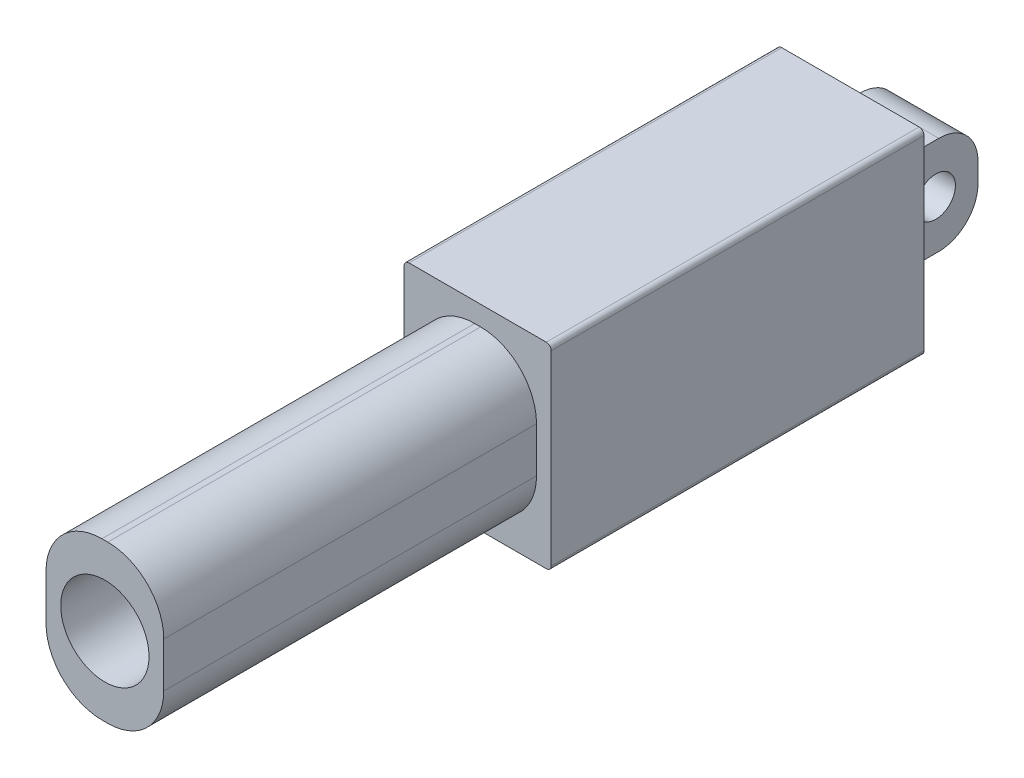
ISO-10303-21;
HEADER;
FILE_DESCRIPTION(('STEP AP214'),'2;1');
FILE_NAME('part.step','',(''),(''),'','','');
FILE_SCHEMA(('AUTOMOTIVE_DESIGN { 1 0 10303 214 1 1 1 1 }'));
ENDSEC;
DATA;
#1=APPLICATION_CONTEXT('core data for automotive mechanical design processes');
#2=APPLICATION_PROTOCOL_DEFINITION('international standard','automotive_design',2000,#1);
#3=PRODUCT_CONTEXT('',#1,'mechanical');
#4=PRODUCT('Part','Part','',(#3));
#5=PRODUCT_RELATED_PRODUCT_CATEGORY('part','',(#4));
#6=PRODUCT_DEFINITION_FORMATION('','',#4);
#7=PRODUCT_DEFINITION_CONTEXT('part definition',#1,'design');
#8=PRODUCT_DEFINITION('design','',#6,#7);
#9=PRODUCT_DEFINITION_SHAPE('','',#8);
#10=(LENGTH_UNIT() NAMED_UNIT(*) SI_UNIT(.MILLI.,.METRE.));
#11=(NAMED_UNIT(*) PLANE_ANGLE_UNIT() SI_UNIT($,.RADIAN.));
#12=(NAMED_UNIT(*) SI_UNIT($,.STERADIAN.) SOLID_ANGLE_UNIT());
#13=UNCERTAINTY_MEASURE_WITH_UNIT(LENGTH_MEASURE(1.E-05),#10,'distance_accuracy_value','');
#14=(GEOMETRIC_REPRESENTATION_CONTEXT(3) GLOBAL_UNCERTAINTY_ASSIGNED_CONTEXT((#13)) GLOBAL_UNIT_ASSIGNED_CONTEXT((#10,
#11,#12)) REPRESENTATION_CONTEXT('',''));
#15=CARTESIAN_POINT('',(0.,0.,0.));
#16=DIRECTION('',(0.,0.,1.));
#17=DIRECTION('',(1.,0.,0.));
#18=AXIS2_PLACEMENT_3D('',#15,#16,#17);
#19=CARTESIAN_POINT('',(0.,0.,0.));
#20=DIRECTION('',(0.,0.,1.));
#21=DIRECTION('',(1.,0.,0.));
#22=AXIS2_PLACEMENT_3D('',#19,#20,#21);
#23=PLANE('',#22);
#24=DIRECTION('',(-1.,0.,0.));
#25=VECTOR('',#24,1.);
#26=CARTESIAN_POINT('',(7.5,10.,0.));
#27=LINE('',#26,#25);
#28=CARTESIAN_POINT('',(7.,10.,0.));
#29=VERTEX_POINT('',#28);
#30=CARTESIAN_POINT('',(-7.,10.,0.));
#31=VERTEX_POINT('',#30);
#32=EDGE_CURVE('E291',#29,#31,#27,.T.);
#33=ORIENTED_EDGE('',*,*,#32,.F.);
#34=CARTESIAN_POINT('',(7.,9.5,0.));
#35=DIRECTION('',(0.,0.,1.));
#36=DIRECTION('',(1.,0.,0.));
#37=AXIS2_PLACEMENT_3D('',#34,#35,#36);
#38=CIRCLE('',#37,0.5);
#39=CARTESIAN_POINT('',(7.5,9.5,0.));
#40=VERTEX_POINT('',#39);
#41=EDGE_CURVE('E339',#29,#40,#38,.F.);
#42=ORIENTED_EDGE('',*,*,#41,.T.);
#43=DIRECTION('',(0.,1.,0.));
#44=VECTOR('',#43,1.);
#45=CARTESIAN_POINT('',(7.5,-10.,0.));
#46=LINE('',#45,#44);
#47=CARTESIAN_POINT('',(7.5,-9.5,0.));
#48=VERTEX_POINT('',#47);
#49=EDGE_CURVE('E304',#48,#40,#46,.T.);
#50=ORIENTED_EDGE('',*,*,#49,.F.);
#51=CARTESIAN_POINT('',(7.,-9.5,0.));
#52=DIRECTION('',(0.,0.,1.));
#53=DIRECTION('',(1.,0.,0.));
#54=AXIS2_PLACEMENT_3D('',#51,#52,#53);
#55=CIRCLE('',#54,0.5);
#56=CARTESIAN_POINT('',(7.,-10.,0.));
#57=VERTEX_POINT('',#56);
#58=EDGE_CURVE('E337',#48,#57,#55,.F.);
#59=ORIENTED_EDGE('',*,*,#58,.T.);
#60=DIRECTION('',(1.,0.,0.));
#61=VECTOR('',#60,1.);
#62=CARTESIAN_POINT('',(7.5,-10.,0.));
#63=LINE('',#62,#61);
#64=CARTESIAN_POINT('',(-7.,-10.,0.));
#65=VERTEX_POINT('',#64);
#66=EDGE_CURVE('E302',#65,#57,#63,.T.);
#67=ORIENTED_EDGE('',*,*,#66,.F.);
#68=CARTESIAN_POINT('',(-7.,-9.5,0.));
#69=DIRECTION('',(0.,0.,1.));
#70=DIRECTION('',(1.,0.,0.));
#71=AXIS2_PLACEMENT_3D('',#68,#69,#70);
#72=CIRCLE('',#71,0.5);
#73=CARTESIAN_POINT('',(-7.5,-9.5,0.));
#74=VERTEX_POINT('',#73);
#75=EDGE_CURVE('E333',#65,#74,#72,.F.);
#76=ORIENTED_EDGE('',*,*,#75,.T.);
#77=DIRECTION('',(0.,-1.,0.));
#78=VECTOR('',#77,1.);
#79=CARTESIAN_POINT('',(-7.5,-10.,0.));
#80=LINE('',#79,#78);
#81=CARTESIAN_POINT('',(-7.5,9.5,0.));
#82=VERTEX_POINT('',#81);
#83=EDGE_CURVE('E287',#82,#74,#80,.T.);
#84=ORIENTED_EDGE('',*,*,#83,.F.);
#85=CARTESIAN_POINT('',(-7.,9.5,0.));
#86=DIRECTION('',(0.,0.,1.));
#87=DIRECTION('',(1.,0.,0.));
#88=AXIS2_PLACEMENT_3D('',#85,#86,#87);
#89=CIRCLE('',#88,0.5);
#90=EDGE_CURVE('E335',#82,#31,#89,.F.);
#91=ORIENTED_EDGE('',*,*,#90,.T.);
#92=EDGE_LOOP('',(#33,#42,#50,#59,#67,#76,#84,#91));
#93=FACE_BOUND('',#92,.T.);
#94=DIRECTION('',(0.,1.,0.));
#95=VECTOR('',#94,1.);
#96=CARTESIAN_POINT('',(-4.,-5.,0.));
#97=LINE('',#96,#95);
#98=CARTESIAN_POINT('',(-4.,-5.,0.));
#99=VERTEX_POINT('',#98);
#100=CARTESIAN_POINT('',(-4.,5.,0.));
#101=VERTEX_POINT('',#100);
#102=EDGE_CURVE('E209',#99,#101,#97,.T.);
#103=ORIENTED_EDGE('',*,*,#102,.F.);
#104=DIRECTION('',(-1.,0.,0.));
#105=VECTOR('',#104,1.);
#106=CARTESIAN_POINT('',(4.,-5.,0.));
#107=LINE('',#106,#105);
#108=CARTESIAN_POINT('',(4.,-5.,0.));
#109=VERTEX_POINT('',#108);
#110=EDGE_CURVE('E205',#109,#99,#107,.T.);
#111=ORIENTED_EDGE('',*,*,#110,.F.);
#112=DIRECTION('',(0.,-1.,0.));
#113=VECTOR('',#112,1.);
#114=CARTESIAN_POINT('',(4.,-5.,0.));
#115=LINE('',#114,#113);
#116=CARTESIAN_POINT('',(4.,5.,0.));
#117=VERTEX_POINT('',#116);
#118=EDGE_CURVE('E189',#117,#109,#115,.T.);
#119=ORIENTED_EDGE('',*,*,#118,.F.);
#120=DIRECTION('',(1.,0.,0.));
#121=VECTOR('',#120,1.);
#122=CARTESIAN_POINT('',(4.,5.,0.));
#123=LINE('',#122,#121);
#124=EDGE_CURVE('E202',#101,#117,#123,.T.);
#125=ORIENTED_EDGE('',*,*,#124,.F.);
#126=EDGE_LOOP('',(#103,#111,#119,#125));
#127=FACE_BOUND('',#126,.T.);
#128=ADVANCED_FACE('F34',(#93,#127),#23,.F.);
#129=CARTESIAN_POINT('',(-7.5,-10.,38.));
#130=DIRECTION('',(1.,0.,0.));
#131=DIRECTION('',(0.,0.,-1.));
#132=AXIS2_PLACEMENT_3D('',#129,#130,#131);
#133=PLANE('',#132);
#134=DIRECTION('',(0.,-1.,0.));
#135=VECTOR('',#134,1.);
#136=CARTESIAN_POINT('',(-7.5,-10.,38.));
#137=LINE('',#136,#135);
#138=CARTESIAN_POINT('',(-7.5,9.5,38.));
#139=VERTEX_POINT('',#138);
#140=CARTESIAN_POINT('',(-7.5,-9.5,38.));
#141=VERTEX_POINT('',#140);
#142=EDGE_CURVE('E288',#139,#141,#137,.T.);
#143=ORIENTED_EDGE('',*,*,#142,.F.);
#144=DIRECTION('',(0.,0.,-1.));
#145=VECTOR('',#144,1.);
#146=CARTESIAN_POINT('',(-7.5,9.5,38.));
#147=LINE('',#146,#145);
#148=EDGE_CURVE('E11',#139,#82,#147,.T.);
#149=ORIENTED_EDGE('',*,*,#148,.T.);
#150=ORIENTED_EDGE('',*,*,#83,.T.);
#151=DIRECTION('',(0.,0.,-1.));
#152=VECTOR('',#151,1.);
#153=CARTESIAN_POINT('',(-7.5,-9.5,38.));
#154=LINE('',#153,#152);
#155=EDGE_CURVE('E42',#74,#141,#154,.F.);
#156=ORIENTED_EDGE('',*,*,#155,.T.);
#157=EDGE_LOOP('',(#143,#149,#150,#156));
#158=FACE_BOUND('',#157,.T.);
#159=ADVANCED_FACE('F359',(#158),#133,.F.);
#160=CARTESIAN_POINT('',(7.5,-10.,38.));
#161=DIRECTION('',(0.,1.,0.));
#162=DIRECTION('',(-1.,0.,0.));
#163=AXIS2_PLACEMENT_3D('',#160,#161,#162);
#164=PLANE('',#163);
#165=ORIENTED_EDGE('',*,*,#66,.T.);
#166=DIRECTION('',(0.,0.,-1.));
#167=VECTOR('',#166,1.);
#168=CARTESIAN_POINT('',(7.,-10.,38.));
#169=LINE('',#168,#167);
#170=CARTESIAN_POINT('',(7.,-10.,38.));
#171=VERTEX_POINT('',#170);
#172=EDGE_CURVE('E49',#57,#171,#169,.F.);
#173=ORIENTED_EDGE('',*,*,#172,.T.);
#174=DIRECTION('',(1.,0.,0.));
#175=VECTOR('',#174,1.);
#176=CARTESIAN_POINT('',(7.5,-10.,38.));
#177=LINE('',#176,#175);
#178=CARTESIAN_POINT('',(-7.,-10.,38.));
#179=VERTEX_POINT('',#178);
#180=EDGE_CURVE('E290',#179,#171,#177,.T.);
#181=ORIENTED_EDGE('',*,*,#180,.F.);
#182=DIRECTION('',(0.,0.,-1.));
#183=VECTOR('',#182,1.);
#184=CARTESIAN_POINT('',(-7.,-10.,38.));
#185=LINE('',#184,#183);
#186=EDGE_CURVE('E353',#179,#65,#185,.T.);
#187=ORIENTED_EDGE('',*,*,#186,.T.);
#188=EDGE_LOOP('',(#165,#173,#181,#187));
#189=FACE_BOUND('',#188,.T.);
#190=ADVANCED_FACE('F367',(#189),#164,.F.);
#191=CARTESIAN_POINT('',(7.5,-10.,38.));
#192=DIRECTION('',(-1.,0.,0.));
#193=DIRECTION('',(0.,0.,1.));
#194=AXIS2_PLACEMENT_3D('',#191,#192,#193);
#195=PLANE('',#194);
#196=ORIENTED_EDGE('',*,*,#49,.T.);
#197=DIRECTION('',(0.,0.,-1.));
#198=VECTOR('',#197,1.);
#199=CARTESIAN_POINT('',(7.5,9.5,38.));
#200=LINE('',#199,#198);
#201=CARTESIAN_POINT('',(7.5,9.5,38.));
#202=VERTEX_POINT('',#201);
#203=EDGE_CURVE('E344',#40,#202,#200,.F.);
#204=ORIENTED_EDGE('',*,*,#203,.T.);
#205=DIRECTION('',(0.,1.,0.));
#206=VECTOR('',#205,1.);
#207=CARTESIAN_POINT('',(7.5,-10.,38.));
#208=LINE('',#207,#206);
#209=CARTESIAN_POINT('',(7.5,-9.5,38.));
#210=VERTEX_POINT('',#209);
#211=EDGE_CURVE('E293',#210,#202,#208,.T.);
#212=ORIENTED_EDGE('',*,*,#211,.F.);
#213=DIRECTION('',(0.,0.,-1.));
#214=VECTOR('',#213,1.);
#215=CARTESIAN_POINT('',(7.5,-9.5,38.));
#216=LINE('',#215,#214);
#217=EDGE_CURVE('E341',#210,#48,#216,.T.);
#218=ORIENTED_EDGE('',*,*,#217,.T.);
#219=EDGE_LOOP('',(#196,#204,#212,#218));
#220=FACE_BOUND('',#219,.T.);
#221=ADVANCED_FACE('F377',(#220),#195,.F.);
#222=CARTESIAN_POINT('',(7.5,10.,38.));
#223=DIRECTION('',(0.,-1.,0.));
#224=DIRECTION('',(1.,0.,0.));
#225=AXIS2_PLACEMENT_3D('',#222,#223,#224);
#226=PLANE('',#225);
#227=DIRECTION('',(-1.,0.,0.));
#228=VECTOR('',#227,1.);
#229=CARTESIAN_POINT('',(7.5,10.,38.));
#230=LINE('',#229,#228);
#231=CARTESIAN_POINT('',(7.,10.,38.));
#232=VERTEX_POINT('',#231);
#233=CARTESIAN_POINT('',(-7.,10.,38.));
#234=VERTEX_POINT('',#233);
#235=EDGE_CURVE('E296',#232,#234,#230,.T.);
#236=ORIENTED_EDGE('',*,*,#235,.F.);
#237=DIRECTION('',(0.,0.,-1.));
#238=VECTOR('',#237,1.);
#239=CARTESIAN_POINT('',(7.,10.,38.));
#240=LINE('',#239,#238);
#241=EDGE_CURVE('E330',#232,#29,#240,.T.);
#242=ORIENTED_EDGE('',*,*,#241,.T.);
#243=ORIENTED_EDGE('',*,*,#32,.T.);
#244=DIRECTION('',(0.,0.,-1.));
#245=VECTOR('',#244,1.);
#246=CARTESIAN_POINT('',(-7.,10.,38.));
#247=LINE('',#246,#245);
#248=EDGE_CURVE('E325',#31,#234,#247,.F.);
#249=ORIENTED_EDGE('',*,*,#248,.T.);
#250=EDGE_LOOP('',(#236,#242,#243,#249));
#251=FACE_BOUND('',#250,.T.);
#252=ADVANCED_FACE('F385',(#251),#226,.F.);
#253=CARTESIAN_POINT('',(0.,0.,38.));
#254=DIRECTION('',(0.,0.,1.));
#255=DIRECTION('',(1.,0.,0.));
#256=AXIS2_PLACEMENT_3D('',#253,#254,#255);
#257=PLANE('',#256);
#258=CARTESIAN_POINT('',(-0.3,-2.3,38.));
#259=DIRECTION('',(0.,0.,1.));
#260=DIRECTION('',(-1.,0.,0.));
#261=AXIS2_PLACEMENT_3D('',#258,#259,#260);
#262=CIRCLE('',#261,5.7);
#263=CARTESIAN_POINT('',(-6.,-2.29999999999996,38.));
#264=VERTEX_POINT('',#263);
#265=CARTESIAN_POINT('',(-0.299999999999959,-8.,38.));
#266=VERTEX_POINT('',#265);
#267=EDGE_CURVE('E222',#264,#266,#262,.T.);
#268=ORIENTED_EDGE('',*,*,#267,.F.);
#269=DIRECTION('',(0.,-1.,0.));
#270=VECTOR('',#269,1.);
#271=CARTESIAN_POINT('',(-6.,-2.29999999999996,38.));
#272=LINE('',#271,#270);
#273=CARTESIAN_POINT('',(-6.,2.29999999999996,38.));
#274=VERTEX_POINT('',#273);
#275=EDGE_CURVE('E227',#274,#264,#272,.T.);
#276=ORIENTED_EDGE('',*,*,#275,.F.);
#277=CARTESIAN_POINT('',(-0.299999999999999,2.3,38.));
#278=DIRECTION('',(0.,0.,1.));
#279=DIRECTION('',(1.,0.,0.));
#280=AXIS2_PLACEMENT_3D('',#277,#278,#279);
#281=CIRCLE('',#280,5.7);
#282=CARTESIAN_POINT('',(-0.299999999999959,8.,38.));
#283=VERTEX_POINT('',#282);
#284=EDGE_CURVE('E259',#283,#274,#281,.T.);
#285=ORIENTED_EDGE('',*,*,#284,.F.);
#286=DIRECTION('',(-1.,0.,0.));
#287=VECTOR('',#286,1.);
#288=CARTESIAN_POINT('',(0.299999999999959,8.,38.));
#289=LINE('',#288,#287);
#290=CARTESIAN_POINT('',(0.299999999999959,8.,38.));
#291=VERTEX_POINT('',#290);
#292=EDGE_CURVE('E256',#291,#283,#289,.T.);
#293=ORIENTED_EDGE('',*,*,#292,.F.);
#294=CARTESIAN_POINT('',(0.3,2.3,38.));
#295=DIRECTION('',(0.,0.,1.));
#296=DIRECTION('',(-1.,0.,0.));
#297=AXIS2_PLACEMENT_3D('',#294,#295,#296);
#298=CIRCLE('',#297,5.7);
#299=CARTESIAN_POINT('',(6.,2.29999999999996,38.));
#300=VERTEX_POINT('',#299);
#301=EDGE_CURVE('E253',#300,#291,#298,.T.);
#302=ORIENTED_EDGE('',*,*,#301,.F.);
#303=DIRECTION('',(0.,1.,0.));
#304=VECTOR('',#303,1.);
#305=CARTESIAN_POINT('',(6.,-2.29999999999996,38.));
#306=LINE('',#305,#304);
#307=CARTESIAN_POINT('',(6.,-2.3,38.));
#308=VERTEX_POINT('',#307);
#309=EDGE_CURVE('E250',#308,#300,#306,.T.);
#310=ORIENTED_EDGE('',*,*,#309,.F.);
#311=CARTESIAN_POINT('',(0.299999999999999,-2.3,38.));
#312=DIRECTION('',(0.,0.,1.));
#313=DIRECTION('',(1.,0.,0.));
#314=AXIS2_PLACEMENT_3D('',#311,#312,#313);
#315=CIRCLE('',#314,5.7);
#316=CARTESIAN_POINT('',(0.299999999999959,-8.,38.));
#317=VERTEX_POINT('',#316);
#318=EDGE_CURVE('E247',#317,#308,#315,.T.);
#319=ORIENTED_EDGE('',*,*,#318,.F.);
#320=DIRECTION('',(1.,0.,0.));
#321=VECTOR('',#320,1.);
#322=CARTESIAN_POINT('',(0.299999999999959,-8.,38.));
#323=LINE('',#322,#321);
#324=EDGE_CURVE('E244',#266,#317,#323,.T.);
#325=ORIENTED_EDGE('',*,*,#324,.F.);
#326=EDGE_LOOP('',(#268,#276,#285,#293,#302,#310,#319,#325));
#327=FACE_BOUND('',#326,.T.);
#328=ORIENTED_EDGE('',*,*,#211,.T.);
#329=CARTESIAN_POINT('',(7.,9.5,38.));
#330=DIRECTION('',(0.,0.,1.));
#331=DIRECTION('',(1.,0.,0.));
#332=AXIS2_PLACEMENT_3D('',#329,#330,#331);
#333=CIRCLE('',#332,0.5);
#334=EDGE_CURVE('E351',#202,#232,#333,.T.);
#335=ORIENTED_EDGE('',*,*,#334,.T.);
#336=ORIENTED_EDGE('',*,*,#235,.T.);
#337=CARTESIAN_POINT('',(-7.,9.5,38.));
#338=DIRECTION('',(0.,0.,1.));
#339=DIRECTION('',(1.,0.,0.));
#340=AXIS2_PLACEMENT_3D('',#337,#338,#339);
#341=CIRCLE('',#340,0.5);
#342=EDGE_CURVE('E347',#234,#139,#341,.T.);
#343=ORIENTED_EDGE('',*,*,#342,.T.);
#344=ORIENTED_EDGE('',*,*,#142,.T.);
#345=CARTESIAN_POINT('',(-7.,-9.5,38.));
#346=DIRECTION('',(0.,0.,1.));
#347=DIRECTION('',(1.,0.,0.));
#348=AXIS2_PLACEMENT_3D('',#345,#346,#347);
#349=CIRCLE('',#348,0.5);
#350=EDGE_CURVE('E56',#141,#179,#349,.T.);
#351=ORIENTED_EDGE('',*,*,#350,.T.);
#352=ORIENTED_EDGE('',*,*,#180,.T.);
#353=CARTESIAN_POINT('',(7.,-9.5,38.));
#354=DIRECTION('',(0.,0.,1.));
#355=DIRECTION('',(1.,0.,0.));
#356=AXIS2_PLACEMENT_3D('',#353,#354,#355);
#357=CIRCLE('',#356,0.5);
#358=EDGE_CURVE('E349',#171,#210,#357,.T.);
#359=ORIENTED_EDGE('',*,*,#358,.T.);
#360=EDGE_LOOP('',(#328,#335,#336,#343,#344,#351,#352,#359));
#361=FACE_BOUND('',#360,.T.);
#362=ADVANCED_FACE('F363',(#327,#361),#257,.T.);
#363=CARTESIAN_POINT('',(-0.3,-2.3,76.));
#364=DIRECTION('',(0.,0.,-1.));
#365=DIRECTION('',(-1.,0.,0.));
#366=AXIS2_PLACEMENT_3D('',#363,#364,#365);
#367=CYLINDRICAL_SURFACE('',#366,5.7);
#368=ORIENTED_EDGE('',*,*,#267,.T.);
#369=DIRECTION('',(0.,0.,-1.));
#370=VECTOR('',#369,1.);
#371=CARTESIAN_POINT('',(-0.299999999999959,-8.,76.));
#372=LINE('',#371,#370);
#373=CARTESIAN_POINT('',(-0.299999999999959,-8.,76.));
#374=VERTEX_POINT('',#373);
#375=EDGE_CURVE('E284',#374,#266,#372,.T.);
#376=ORIENTED_EDGE('',*,*,#375,.F.);
#377=CARTESIAN_POINT('',(-0.3,-2.3,76.));
#378=DIRECTION('',(0.,0.,1.));
#379=DIRECTION('',(-1.,0.,0.));
#380=AXIS2_PLACEMENT_3D('',#377,#378,#379);
#381=CIRCLE('',#380,5.7);
#382=CARTESIAN_POINT('',(-6.,-2.29999999999996,76.));
#383=VERTEX_POINT('',#382);
#384=EDGE_CURVE('E223',#383,#374,#381,.T.);
#385=ORIENTED_EDGE('',*,*,#384,.F.);
#386=DIRECTION('',(0.,0.,-1.));
#387=VECTOR('',#386,1.);
#388=CARTESIAN_POINT('',(-6.,-2.29999999999996,76.));
#389=LINE('',#388,#387);
#390=EDGE_CURVE('E241',#383,#264,#389,.T.);
#391=ORIENTED_EDGE('',*,*,#390,.T.);
#392=EDGE_LOOP('',(#368,#376,#385,#391));
#393=FACE_BOUND('',#392,.T.);
#394=ADVANCED_FACE('F480',(#393),#367,.T.);
#395=CARTESIAN_POINT('',(0.299999999999959,-8.,76.));
#396=DIRECTION('',(0.,1.,0.));
#397=DIRECTION('',(0.,0.,1.));
#398=AXIS2_PLACEMENT_3D('',#395,#396,#397);
#399=PLANE('',#398);
#400=ORIENTED_EDGE('',*,*,#324,.T.);
#401=DIRECTION('',(0.,0.,-1.));
#402=VECTOR('',#401,1.);
#403=CARTESIAN_POINT('',(0.299999999999959,-8.,76.));
#404=LINE('',#403,#402);
#405=CARTESIAN_POINT('',(0.299999999999959,-8.,76.));
#406=VERTEX_POINT('',#405);
#407=EDGE_CURVE('E281',#406,#317,#404,.T.);
#408=ORIENTED_EDGE('',*,*,#407,.F.);
#409=DIRECTION('',(1.,0.,0.));
#410=VECTOR('',#409,1.);
#411=CARTESIAN_POINT('',(0.299999999999959,-8.,76.));
#412=LINE('',#411,#410);
#413=EDGE_CURVE('E226',#374,#406,#412,.T.);
#414=ORIENTED_EDGE('',*,*,#413,.F.);
#415=ORIENTED_EDGE('',*,*,#375,.T.);
#416=EDGE_LOOP('',(#400,#408,#414,#415));
#417=FACE_BOUND('',#416,.T.);
#418=ADVANCED_FACE('F477',(#417),#399,.F.);
#419=CARTESIAN_POINT('',(0.299999999999999,-2.3,76.));
#420=DIRECTION('',(0.,0.,-1.));
#421=DIRECTION('',(-1.,0.,0.));
#422=AXIS2_PLACEMENT_3D('',#419,#420,#421);
#423=CYLINDRICAL_SURFACE('',#422,5.7);
#424=ORIENTED_EDGE('',*,*,#318,.T.);
#425=DIRECTION('',(0.,0.,-1.));
#426=VECTOR('',#425,1.);
#427=CARTESIAN_POINT('',(6.,-2.3,76.));
#428=LINE('',#427,#426);
#429=CARTESIAN_POINT('',(6.,-2.3,76.));
#430=VERTEX_POINT('',#429);
#431=EDGE_CURVE('E278',#430,#308,#428,.T.);
#432=ORIENTED_EDGE('',*,*,#431,.F.);
#433=CARTESIAN_POINT('',(0.299999999999999,-2.3,76.));
#434=DIRECTION('',(0.,0.,1.));
#435=DIRECTION('',(1.,0.,0.));
#436=AXIS2_PLACEMENT_3D('',#433,#434,#435);
#437=CIRCLE('',#436,5.7);
#438=EDGE_CURVE('E229',#406,#430,#437,.T.);
#439=ORIENTED_EDGE('',*,*,#438,.F.);
#440=ORIENTED_EDGE('',*,*,#407,.T.);
#441=EDGE_LOOP('',(#424,#432,#439,#440));
#442=FACE_BOUND('',#441,.T.);
#443=ADVANCED_FACE('F473',(#442),#423,.T.);
#444=CARTESIAN_POINT('',(6.,-2.29999999999996,76.));
#445=DIRECTION('',(-1.,0.,0.));
#446=DIRECTION('',(0.,0.,1.));
#447=AXIS2_PLACEMENT_3D('',#444,#445,#446);
#448=PLANE('',#447);
#449=ORIENTED_EDGE('',*,*,#309,.T.);
#450=DIRECTION('',(0.,0.,-1.));
#451=VECTOR('',#450,1.);
#452=CARTESIAN_POINT('',(6.,2.29999999999996,76.));
#453=LINE('',#452,#451);
#454=CARTESIAN_POINT('',(6.,2.29999999999996,76.));
#455=VERTEX_POINT('',#454);
#456=EDGE_CURVE('E275',#455,#300,#453,.T.);
#457=ORIENTED_EDGE('',*,*,#456,.F.);
#458=DIRECTION('',(0.,1.,0.));
#459=VECTOR('',#458,1.);
#460=CARTESIAN_POINT('',(6.,-2.29999999999996,76.));
#461=LINE('',#460,#459);
#462=EDGE_CURVE('E231',#430,#455,#461,.T.);
#463=ORIENTED_EDGE('',*,*,#462,.F.);
#464=ORIENTED_EDGE('',*,*,#431,.T.);
#465=EDGE_LOOP('',(#449,#457,#463,#464));
#466=FACE_BOUND('',#465,.T.);
#467=ADVANCED_FACE('F469',(#466),#448,.F.);
#468=CARTESIAN_POINT('',(0.3,2.3,76.));
#469=DIRECTION('',(0.,0.,-1.));
#470=DIRECTION('',(-1.,0.,0.));
#471=AXIS2_PLACEMENT_3D('',#468,#469,#470);
#472=CYLINDRICAL_SURFACE('',#471,5.7);
#473=ORIENTED_EDGE('',*,*,#301,.T.);
#474=DIRECTION('',(0.,0.,-1.));
#475=VECTOR('',#474,1.);
#476=CARTESIAN_POINT('',(0.299999999999959,8.,76.));
#477=LINE('',#476,#475);
#478=CARTESIAN_POINT('',(0.299999999999959,8.,76.));
#479=VERTEX_POINT('',#478);
#480=EDGE_CURVE('E272',#479,#291,#477,.T.);
#481=ORIENTED_EDGE('',*,*,#480,.F.);
#482=CARTESIAN_POINT('',(0.3,2.3,76.));
#483=DIRECTION('',(0.,0.,1.));
#484=DIRECTION('',(-1.,0.,0.));
#485=AXIS2_PLACEMENT_3D('',#482,#483,#484);
#486=CIRCLE('',#485,5.7);
#487=EDGE_CURVE('E233',#455,#479,#486,.T.);
#488=ORIENTED_EDGE('',*,*,#487,.F.);
#489=ORIENTED_EDGE('',*,*,#456,.T.);
#490=EDGE_LOOP('',(#473,#481,#488,#489));
#491=FACE_BOUND('',#490,.T.);
#492=ADVANCED_FACE('F465',(#491),#472,.T.);
#493=CARTESIAN_POINT('',(0.299999999999959,8.,76.));
#494=DIRECTION('',(0.,-1.,0.));
#495=DIRECTION('',(0.,0.,-1.));
#496=AXIS2_PLACEMENT_3D('',#493,#494,#495);
#497=PLANE('',#496);
#498=ORIENTED_EDGE('',*,*,#292,.T.);
#499=DIRECTION('',(0.,0.,-1.));
#500=VECTOR('',#499,1.);
#501=CARTESIAN_POINT('',(-0.299999999999959,8.,76.));
#502=LINE('',#501,#500);
#503=CARTESIAN_POINT('',(-0.299999999999959,8.,76.));
#504=VERTEX_POINT('',#503);
#505=EDGE_CURVE('E269',#504,#283,#502,.T.);
#506=ORIENTED_EDGE('',*,*,#505,.F.);
#507=DIRECTION('',(-1.,0.,0.));
#508=VECTOR('',#507,1.);
#509=CARTESIAN_POINT('',(0.299999999999959,8.,76.));
#510=LINE('',#509,#508);
#511=EDGE_CURVE('E235',#479,#504,#510,.T.);
#512=ORIENTED_EDGE('',*,*,#511,.F.);
#513=ORIENTED_EDGE('',*,*,#480,.T.);
#514=EDGE_LOOP('',(#498,#506,#512,#513));
#515=FACE_BOUND('',#514,.T.);
#516=ADVANCED_FACE('F461',(#515),#497,.F.);
#517=CARTESIAN_POINT('',(-0.299999999999999,2.3,76.));
#518=DIRECTION('',(0.,0.,-1.));
#519=DIRECTION('',(-1.,0.,0.));
#520=AXIS2_PLACEMENT_3D('',#517,#518,#519);
#521=CYLINDRICAL_SURFACE('',#520,5.7);
#522=ORIENTED_EDGE('',*,*,#284,.T.);
#523=DIRECTION('',(0.,0.,-1.));
#524=VECTOR('',#523,1.);
#525=CARTESIAN_POINT('',(-6.,2.29999999999996,76.));
#526=LINE('',#525,#524);
#527=CARTESIAN_POINT('',(-6.,2.29999999999996,76.));
#528=VERTEX_POINT('',#527);
#529=EDGE_CURVE('E266',#528,#274,#526,.T.);
#530=ORIENTED_EDGE('',*,*,#529,.F.);
#531=CARTESIAN_POINT('',(-0.299999999999999,2.3,76.));
#532=DIRECTION('',(0.,0.,1.));
#533=DIRECTION('',(1.,0.,0.));
#534=AXIS2_PLACEMENT_3D('',#531,#532,#533);
#535=CIRCLE('',#534,5.7);
#536=EDGE_CURVE('E237',#504,#528,#535,.T.);
#537=ORIENTED_EDGE('',*,*,#536,.F.);
#538=ORIENTED_EDGE('',*,*,#505,.T.);
#539=EDGE_LOOP('',(#522,#530,#537,#538));
#540=FACE_BOUND('',#539,.T.);
#541=ADVANCED_FACE('F457',(#540),#521,.T.);
#542=CARTESIAN_POINT('',(-6.,-2.29999999999996,76.));
#543=DIRECTION('',(1.,0.,0.));
#544=DIRECTION('',(0.,0.,-1.));
#545=AXIS2_PLACEMENT_3D('',#542,#543,#544);
#546=PLANE('',#545);
#547=ORIENTED_EDGE('',*,*,#275,.T.);
#548=ORIENTED_EDGE('',*,*,#390,.F.);
#549=DIRECTION('',(0.,-1.,0.));
#550=VECTOR('',#549,1.);
#551=CARTESIAN_POINT('',(-6.,-2.29999999999996,76.));
#552=LINE('',#551,#550);
#553=EDGE_CURVE('E239',#528,#383,#552,.T.);
#554=ORIENTED_EDGE('',*,*,#553,.F.);
#555=ORIENTED_EDGE('',*,*,#529,.T.);
#556=EDGE_LOOP('',(#547,#548,#554,#555));
#557=FACE_BOUND('',#556,.T.);
#558=ADVANCED_FACE('F453',(#557),#546,.F.);
#559=CARTESIAN_POINT('',(-0.3,-2.3,76.));
#560=DIRECTION('',(0.,0.,-1.));
#561=DIRECTION('',(-1.,0.,0.));
#562=AXIS2_PLACEMENT_3D('',#559,#560,#561);
#563=PLANE('',#562);
#564=CARTESIAN_POINT('',(0.,0.,76.));
#565=DIRECTION('',(0.,0.,1.));
#566=DIRECTION('',(1.,0.,0.));
#567=AXIS2_PLACEMENT_3D('',#564,#565,#566);
#568=CIRCLE('',#567,4.5);
#569=CARTESIAN_POINT('',(4.5,0.,76.));
#570=VERTEX_POINT('',#569);
#571=EDGE_CURVE('E660',#570,#570,#568,.T.);
#572=ORIENTED_EDGE('',*,*,#571,.F.);
#573=EDGE_LOOP('',(#572));
#574=FACE_BOUND('',#573,.T.);
#575=ORIENTED_EDGE('',*,*,#384,.T.);
#576=ORIENTED_EDGE('',*,*,#413,.T.);
#577=ORIENTED_EDGE('',*,*,#438,.T.);
#578=ORIENTED_EDGE('',*,*,#462,.T.);
#579=ORIENTED_EDGE('',*,*,#487,.T.);
#580=ORIENTED_EDGE('',*,*,#511,.T.);
#581=ORIENTED_EDGE('',*,*,#536,.T.);
#582=ORIENTED_EDGE('',*,*,#553,.T.);
#583=EDGE_LOOP('',(#575,#576,#577,#578,#579,#580,#581,#582));
#584=FACE_BOUND('',#583,.T.);
#585=ADVANCED_FACE('F449',(#574,#584),#563,.F.);
#586=CARTESIAN_POINT('',(-4.,-5.,-9.));
#587=DIRECTION('',(1.,0.,0.));
#588=DIRECTION('',(0.,0.,-1.));
#589=AXIS2_PLACEMENT_3D('',#586,#587,#588);
#590=PLANE('',#589);
#591=CARTESIAN_POINT('',(-4.,0.,-4.7));
#592=DIRECTION('',(-1.,0.,0.));
#593=DIRECTION('',(0.,0.,1.));
#594=AXIS2_PLACEMENT_3D('',#591,#592,#593);
#595=CIRCLE('',#594,2.);
#596=CARTESIAN_POINT('',(-4.,0.,-2.7));
#597=VERTEX_POINT('',#596);
#598=EDGE_CURVE('E328',#597,#597,#595,.T.);
#599=ORIENTED_EDGE('',*,*,#598,.F.);
#600=EDGE_LOOP('',(#599));
#601=FACE_BOUND('',#600,.T.);
#602=DIRECTION('',(0.,1.,0.));
#603=VECTOR('',#602,1.);
#604=CARTESIAN_POINT('',(-4.,-5.,-9.));
#605=LINE('',#604,#603);
#606=CARTESIAN_POINT('',(-4.,-1.,-9.));
#607=VERTEX_POINT('',#606);
#608=CARTESIAN_POINT('',(-4.,1.,-9.));
#609=VERTEX_POINT('',#608);
#610=EDGE_CURVE('E216',#607,#609,#605,.T.);
#611=ORIENTED_EDGE('',*,*,#610,.F.);
#612=CARTESIAN_POINT('',(-4.,-1.,-5.));
#613=DIRECTION('',(1.,0.,0.));
#614=DIRECTION('',(0.,0.,-1.));
#615=AXIS2_PLACEMENT_3D('',#612,#613,#614);
#616=CIRCLE('',#615,4.);
#617=CARTESIAN_POINT('',(-4.,-5.,-5.));
#618=VERTEX_POINT('',#617);
#619=EDGE_CURVE('E316',#607,#618,#616,.F.);
#620=ORIENTED_EDGE('',*,*,#619,.T.);
#621=DIRECTION('',(0.,0.,1.));
#622=VECTOR('',#621,1.);
#623=CARTESIAN_POINT('',(-4.,-5.,-9.));
#624=LINE('',#623,#622);
#625=EDGE_CURVE('E217',#618,#99,#624,.T.);
#626=ORIENTED_EDGE('',*,*,#625,.T.);
#627=ORIENTED_EDGE('',*,*,#102,.T.);
#628=DIRECTION('',(0.,0.,1.));
#629=VECTOR('',#628,1.);
#630=CARTESIAN_POINT('',(-4.,5.,-9.));
#631=LINE('',#630,#629);
#632=CARTESIAN_POINT('',(-4.,5.,-5.));
#633=VERTEX_POINT('',#632);
#634=EDGE_CURVE('E195',#633,#101,#631,.T.);
#635=ORIENTED_EDGE('',*,*,#634,.F.);
#636=CARTESIAN_POINT('',(-4.,1.,-5.));
#637=DIRECTION('',(1.,0.,0.));
#638=DIRECTION('',(0.,0.,-1.));
#639=AXIS2_PLACEMENT_3D('',#636,#637,#638);
#640=CIRCLE('',#639,4.);
#641=EDGE_CURVE('E314',#633,#609,#640,.F.);
#642=ORIENTED_EDGE('',*,*,#641,.T.);
#643=EDGE_LOOP('',(#611,#620,#626,#627,#635,#642));
#644=FACE_BOUND('',#643,.T.);
#645=ADVANCED_FACE('F446',(#601,#644),#590,.F.);
#646=CARTESIAN_POINT('',(4.,5.,-9.));
#647=DIRECTION('',(0.,-1.,0.));
#648=DIRECTION('',(0.,0.,-1.));
#649=AXIS2_PLACEMENT_3D('',#646,#647,#648);
#650=PLANE('',#649);
#651=DIRECTION('',(0.,0.,1.));
#652=VECTOR('',#651,1.);
#653=CARTESIAN_POINT('',(4.,5.,-9.));
#654=LINE('',#653,#652);
#655=CARTESIAN_POINT('',(4.,5.,-5.));
#656=VERTEX_POINT('',#655);
#657=EDGE_CURVE('E185',#656,#117,#654,.T.);
#658=ORIENTED_EDGE('',*,*,#657,.F.);
#659=DIRECTION('',(1.,0.,0.));
#660=VECTOR('',#659,1.);
#661=CARTESIAN_POINT('',(4.,5.,-5.));
#662=LINE('',#661,#660);
#663=EDGE_CURVE('E323',#656,#633,#662,.F.);
#664=ORIENTED_EDGE('',*,*,#663,.T.);
#665=ORIENTED_EDGE('',*,*,#634,.T.);
#666=ORIENTED_EDGE('',*,*,#124,.T.);
#667=EDGE_LOOP('',(#658,#664,#665,#666));
#668=FACE_BOUND('',#667,.T.);
#669=ADVANCED_FACE('F207',(#668),#650,.F.);
#670=CARTESIAN_POINT('',(4.,-5.,-9.));
#671=DIRECTION('',(-1.,0.,0.));
#672=DIRECTION('',(0.,0.,1.));
#673=AXIS2_PLACEMENT_3D('',#670,#671,#672);
#674=PLANE('',#673);
#675=CARTESIAN_POINT('',(4.,0.,-4.7));
#676=DIRECTION('',(-1.,0.,0.));
#677=DIRECTION('',(0.,0.,1.));
#678=AXIS2_PLACEMENT_3D('',#675,#676,#677);
#679=CIRCLE('',#678,2.);
#680=CARTESIAN_POINT('',(4.,0.,-2.7));
#681=VERTEX_POINT('',#680);
#682=EDGE_CURVE('E211',#681,#681,#679,.T.);
#683=ORIENTED_EDGE('',*,*,#682,.T.);
#684=EDGE_LOOP('',(#683));
#685=FACE_BOUND('',#684,.T.);
#686=DIRECTION('',(0.,0.,1.));
#687=VECTOR('',#686,1.);
#688=CARTESIAN_POINT('',(4.,-5.,-9.));
#689=LINE('',#688,#687);
#690=CARTESIAN_POINT('',(4.,-5.,-5.));
#691=VERTEX_POINT('',#690);
#692=EDGE_CURVE('E196',#691,#109,#689,.T.);
#693=ORIENTED_EDGE('',*,*,#692,.F.);
#694=CARTESIAN_POINT('',(4.,-1.,-5.));
#695=DIRECTION('',(-1.,0.,0.));
#696=DIRECTION('',(0.,0.,1.));
#697=AXIS2_PLACEMENT_3D('',#694,#695,#696);
#698=CIRCLE('',#697,4.);
#699=CARTESIAN_POINT('',(4.,-1.,-9.));
#700=VERTEX_POINT('',#699);
#701=EDGE_CURVE('E321',#691,#700,#698,.F.);
#702=ORIENTED_EDGE('',*,*,#701,.T.);
#703=DIRECTION('',(0.,-1.,0.));
#704=VECTOR('',#703,1.);
#705=CARTESIAN_POINT('',(4.,-5.,-9.));
#706=LINE('',#705,#704);
#707=CARTESIAN_POINT('',(4.,1.,-9.));
#708=VERTEX_POINT('',#707);
#709=EDGE_CURVE('E219',#708,#700,#706,.T.);
#710=ORIENTED_EDGE('',*,*,#709,.F.);
#711=CARTESIAN_POINT('',(4.,1.,-5.));
#712=DIRECTION('',(-1.,0.,0.));
#713=DIRECTION('',(0.,0.,1.));
#714=AXIS2_PLACEMENT_3D('',#711,#712,#713);
#715=CIRCLE('',#714,4.);
#716=EDGE_CURVE('E191',#708,#656,#715,.F.);
#717=ORIENTED_EDGE('',*,*,#716,.T.);
#718=ORIENTED_EDGE('',*,*,#657,.T.);
#719=ORIENTED_EDGE('',*,*,#118,.T.);
#720=EDGE_LOOP('',(#693,#702,#710,#717,#718,#719));
#721=FACE_BOUND('',#720,.T.);
#722=ADVANCED_FACE('F188',(#685,#721),#674,.F.);
#723=CARTESIAN_POINT('',(4.,-5.,-9.));
#724=DIRECTION('',(0.,1.,0.));
#725=DIRECTION('',(0.,0.,1.));
#726=AXIS2_PLACEMENT_3D('',#723,#724,#725);
#727=PLANE('',#726);
#728=ORIENTED_EDGE('',*,*,#625,.F.);
#729=DIRECTION('',(-1.,0.,0.));
#730=VECTOR('',#729,1.);
#731=CARTESIAN_POINT('',(4.,-5.,-5.));
#732=LINE('',#731,#730);
#733=EDGE_CURVE('E318',#618,#691,#732,.F.);
#734=ORIENTED_EDGE('',*,*,#733,.T.);
#735=ORIENTED_EDGE('',*,*,#692,.T.);
#736=ORIENTED_EDGE('',*,*,#110,.T.);
#737=EDGE_LOOP('',(#728,#734,#735,#736));
#738=FACE_BOUND('',#737,.T.);
#739=ADVANCED_FACE('F436',(#738),#727,.F.);
#740=CARTESIAN_POINT('',(0.,0.,-9.));
#741=DIRECTION('',(0.,0.,1.));
#742=DIRECTION('',(1.,0.,0.));
#743=AXIS2_PLACEMENT_3D('',#740,#741,#742);
#744=PLANE('',#743);
#745=ORIENTED_EDGE('',*,*,#709,.T.);
#746=DIRECTION('',(-1.,0.,0.));
#747=VECTOR('',#746,1.);
#748=CARTESIAN_POINT('',(0.,-1.,-9.));
#749=LINE('',#748,#747);
#750=EDGE_CURVE('E311',#700,#607,#749,.T.);
#751=ORIENTED_EDGE('',*,*,#750,.T.);
#752=ORIENTED_EDGE('',*,*,#610,.T.);
#753=DIRECTION('',(1.,0.,0.));
#754=VECTOR('',#753,1.);
#755=CARTESIAN_POINT('',(0.,1.,-9.));
#756=LINE('',#755,#754);
#757=EDGE_CURVE('E299',#609,#708,#756,.T.);
#758=ORIENTED_EDGE('',*,*,#757,.T.);
#759=EDGE_LOOP('',(#745,#751,#752,#758));
#760=FACE_BOUND('',#759,.T.);
#761=ADVANCED_FACE('F415',(#760),#744,.F.);
#762=CARTESIAN_POINT('',(0.,-1.,-5.));
#763=DIRECTION('',(-1.,0.,0.));
#764=DIRECTION('',(0.,0.,1.));
#765=AXIS2_PLACEMENT_3D('',#762,#763,#764);
#766=CYLINDRICAL_SURFACE('',#765,4.);
#767=ORIENTED_EDGE('',*,*,#701,.F.);
#768=ORIENTED_EDGE('',*,*,#733,.F.);
#769=ORIENTED_EDGE('',*,*,#619,.F.);
#770=ORIENTED_EDGE('',*,*,#750,.F.);
#771=EDGE_LOOP('',(#767,#768,#769,#770));
#772=FACE_BOUND('',#771,.T.);
#773=ADVANCED_FACE('F411',(#772),#766,.T.);
#774=CARTESIAN_POINT('',(0.,1.,-5.));
#775=DIRECTION('',(1.,0.,0.));
#776=DIRECTION('',(0.,0.,-1.));
#777=AXIS2_PLACEMENT_3D('',#774,#775,#776);
#778=CYLINDRICAL_SURFACE('',#777,4.);
#779=ORIENTED_EDGE('',*,*,#641,.F.);
#780=ORIENTED_EDGE('',*,*,#663,.F.);
#781=ORIENTED_EDGE('',*,*,#716,.F.);
#782=ORIENTED_EDGE('',*,*,#757,.F.);
#783=EDGE_LOOP('',(#779,#780,#781,#782));
#784=FACE_BOUND('',#783,.T.);
#785=ADVANCED_FACE('F414',(#784),#778,.T.);
#786=CARTESIAN_POINT('',(7.5,0.,-4.7));
#787=DIRECTION('',(-1.,0.,0.));
#788=DIRECTION('',(0.,0.,1.));
#789=AXIS2_PLACEMENT_3D('',#786,#787,#788);
#790=CYLINDRICAL_SURFACE('',#789,2.);
#791=ORIENTED_EDGE('',*,*,#598,.T.);
#792=EDGE_LOOP('',(#791));
#793=FACE_BOUND('',#792,.T.);
#794=ORIENTED_EDGE('',*,*,#682,.F.);
#795=EDGE_LOOP('',(#794));
#796=FACE_BOUND('',#795,.T.);
#797=ADVANCED_FACE('F419',(#793,#796),#790,.F.);
#798=CARTESIAN_POINT('',(7.,9.5,38.));
#799=DIRECTION('',(0.,0.,-1.));
#800=DIRECTION('',(-1.,0.,0.));
#801=AXIS2_PLACEMENT_3D('',#798,#799,#800);
#802=CYLINDRICAL_SURFACE('',#801,0.5);
#803=ORIENTED_EDGE('',*,*,#334,.F.);
#804=ORIENTED_EDGE('',*,*,#203,.F.);
#805=ORIENTED_EDGE('',*,*,#41,.F.);
#806=ORIENTED_EDGE('',*,*,#241,.F.);
#807=EDGE_LOOP('',(#803,#804,#805,#806));
#808=FACE_BOUND('',#807,.T.);
#809=ADVANCED_FACE('F383',(#808),#802,.T.);
#810=CARTESIAN_POINT('',(7.,-9.5,38.));
#811=DIRECTION('',(0.,0.,-1.));
#812=DIRECTION('',(-1.,0.,0.));
#813=AXIS2_PLACEMENT_3D('',#810,#811,#812);
#814=CYLINDRICAL_SURFACE('',#813,0.5);
#815=ORIENTED_EDGE('',*,*,#358,.F.);
#816=ORIENTED_EDGE('',*,*,#172,.F.);
#817=ORIENTED_EDGE('',*,*,#58,.F.);
#818=ORIENTED_EDGE('',*,*,#217,.F.);
#819=EDGE_LOOP('',(#815,#816,#817,#818));
#820=FACE_BOUND('',#819,.T.);
#821=ADVANCED_FACE('F374',(#820),#814,.T.);
#822=CARTESIAN_POINT('',(-7.,9.5,38.));
#823=DIRECTION('',(0.,0.,-1.));
#824=DIRECTION('',(-1.,0.,0.));
#825=AXIS2_PLACEMENT_3D('',#822,#823,#824);
#826=CYLINDRICAL_SURFACE('',#825,0.5);
#827=ORIENTED_EDGE('',*,*,#342,.F.);
#828=ORIENTED_EDGE('',*,*,#248,.F.);
#829=ORIENTED_EDGE('',*,*,#90,.F.);
#830=ORIENTED_EDGE('',*,*,#148,.F.);
#831=EDGE_LOOP('',(#827,#828,#829,#830));
#832=FACE_BOUND('',#831,.T.);
#833=ADVANCED_FACE('F388',(#832),#826,.T.);
#834=CARTESIAN_POINT('',(-7.,-9.5,38.));
#835=DIRECTION('',(0.,0.,-1.));
#836=DIRECTION('',(-1.,0.,0.));
#837=AXIS2_PLACEMENT_3D('',#834,#835,#836);
#838=CYLINDRICAL_SURFACE('',#837,0.5);
#839=ORIENTED_EDGE('',*,*,#350,.F.);
#840=ORIENTED_EDGE('',*,*,#155,.F.);
#841=ORIENTED_EDGE('',*,*,#75,.F.);
#842=ORIENTED_EDGE('',*,*,#186,.F.);
#843=EDGE_LOOP('',(#839,#840,#841,#842));
#844=FACE_BOUND('',#843,.T.);
#845=ADVANCED_FACE('F36',(#844),#838,.T.);
#846=CARTESIAN_POINT('',(0.,0.,41.));
#847=DIRECTION('',(0.,0.,1.));
#848=DIRECTION('',(1.,0.,0.));
#849=AXIS2_PLACEMENT_3D('',#846,#847,#848);
#850=CYLINDRICAL_SURFACE('',#849,4.5);
#851=CARTESIAN_POINT('',(0.,0.,41.));
#852=DIRECTION('',(0.,0.,1.));
#853=DIRECTION('',(1.,0.,0.));
#854=AXIS2_PLACEMENT_3D('',#851,#852,#853);
#855=CIRCLE('',#854,4.5);
#856=CARTESIAN_POINT('',(4.5,0.,41.));
#857=VERTEX_POINT('',#856);
#858=EDGE_CURVE('E659',#857,#857,#855,.T.);
#859=ORIENTED_EDGE('',*,*,#858,.F.);
#860=EDGE_LOOP('',(#859));
#861=FACE_BOUND('',#860,.T.);
#862=ORIENTED_EDGE('',*,*,#571,.T.);
#863=EDGE_LOOP('',(#862));
#864=FACE_BOUND('',#863,.T.);
#865=ADVANCED_FACE('F394',(#861,#864),#850,.F.);
#866=CARTESIAN_POINT('',(0.,0.,41.));
#867=DIRECTION('',(0.,0.,1.));
#868=DIRECTION('',(1.,0.,0.));
#869=AXIS2_PLACEMENT_3D('',#866,#867,#868);
#870=PLANE('',#869);
#871=ORIENTED_EDGE('',*,*,#858,.T.);
#872=EDGE_LOOP('',(#871));
#873=FACE_BOUND('',#872,.T.);
#874=ADVANCED_FACE('F645',(#873),#870,.T.);
#875=CLOSED_SHELL('',(#128,#159,#190,#221,#252,#362,#394,#418,#443,#467,#492,#516,#541,#558,
#585,#645,#669,#722,#739,#761,#773,#785,#797,#809,#821,#833,#845,#865,#874));
#876=MANIFOLD_SOLID_BREP('B2',#875);
#877=ADVANCED_BREP_SHAPE_REPRESENTATION('',(#18,#876),#14);
#878=SHAPE_DEFINITION_REPRESENTATION(#9,#877);
ENDSEC;
END-ISO-10303-21;
